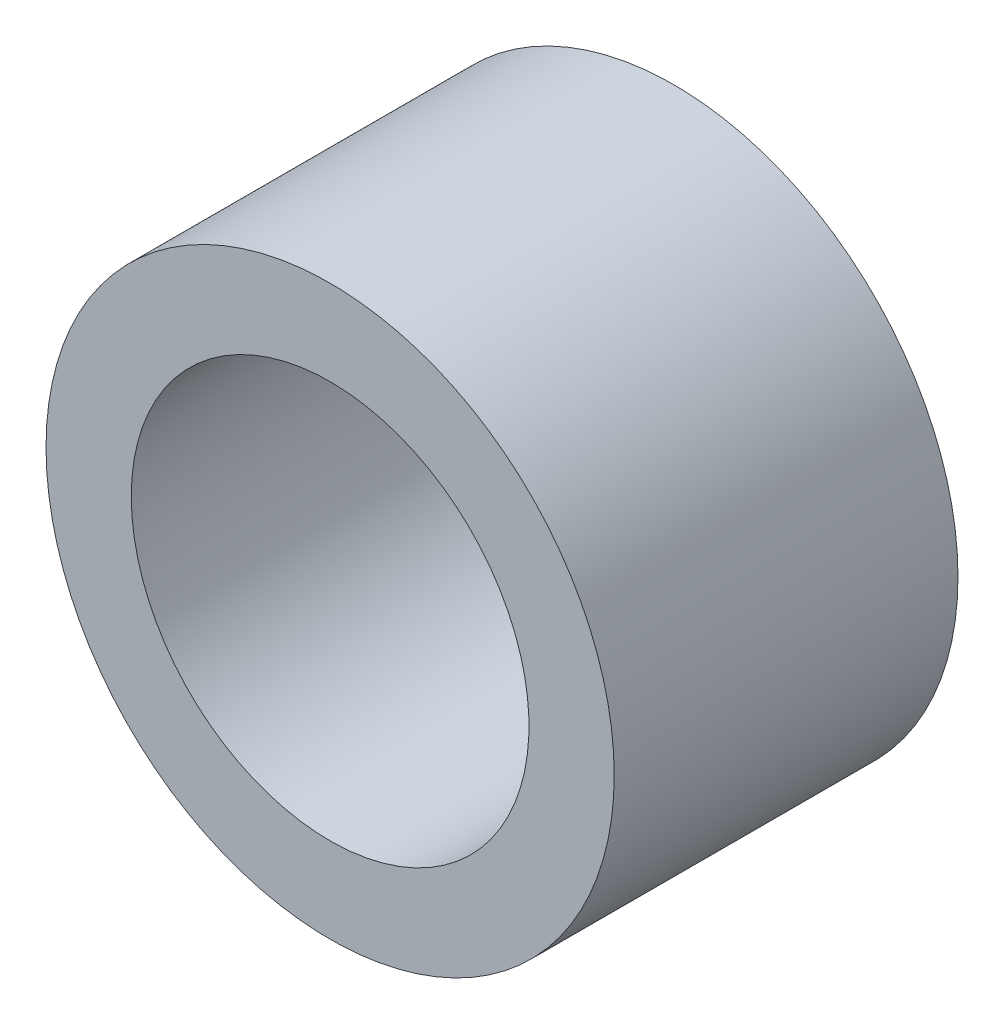
ISO-10303-21;
HEADER;
FILE_DESCRIPTION(('STEP AP214'),'2;1');
FILE_NAME('part.step','',(''),(''),'','','');
FILE_SCHEMA(('AUTOMOTIVE_DESIGN { 1 0 10303 214 1 1 1 1 }'));
ENDSEC;
DATA;
#1=APPLICATION_CONTEXT('core data for automotive mechanical design processes');
#2=APPLICATION_PROTOCOL_DEFINITION('international standard','automotive_design',2000,#1);
#3=PRODUCT_CONTEXT('',#1,'mechanical');
#4=PRODUCT('Part','Part','',(#3));
#5=PRODUCT_RELATED_PRODUCT_CATEGORY('part','',(#4));
#6=PRODUCT_DEFINITION_FORMATION('','',#4);
#7=PRODUCT_DEFINITION_CONTEXT('part definition',#1,'design');
#8=PRODUCT_DEFINITION('design','',#6,#7);
#9=PRODUCT_DEFINITION_SHAPE('','',#8);
#10=(LENGTH_UNIT() NAMED_UNIT(*) SI_UNIT(.MILLI.,.METRE.));
#11=(NAMED_UNIT(*) PLANE_ANGLE_UNIT() SI_UNIT($,.RADIAN.));
#12=(NAMED_UNIT(*) SI_UNIT($,.STERADIAN.) SOLID_ANGLE_UNIT());
#13=UNCERTAINTY_MEASURE_WITH_UNIT(LENGTH_MEASURE(1.E-05),#10,'distance_accuracy_value','');
#14=(GEOMETRIC_REPRESENTATION_CONTEXT(3) GLOBAL_UNCERTAINTY_ASSIGNED_CONTEXT((#13)) GLOBAL_UNIT_ASSIGNED_CONTEXT((#10,
#11,#12)) REPRESENTATION_CONTEXT('',''));
#15=CARTESIAN_POINT('',(0.,0.,0.));
#16=DIRECTION('',(0.,0.,1.));
#17=DIRECTION('',(1.,0.,0.));
#18=AXIS2_PLACEMENT_3D('',#15,#16,#17);
#19=CARTESIAN_POINT('',(0.,0.,121.));
#20=DIRECTION('',(0.,0.,1.));
#21=DIRECTION('',(1.,0.,0.));
#22=AXIS2_PLACEMENT_3D('',#19,#20,#21);
#23=PLANE('',#22);
#24=CARTESIAN_POINT('',(0.,0.,121.));
#25=DIRECTION('',(0.,0.,1.));
#26=DIRECTION('',(1.,0.,0.));
#27=AXIS2_PLACEMENT_3D('',#24,#25,#26);
#28=CIRCLE('',#27,100.);
#29=CARTESIAN_POINT('',(-100.,0.,121.));
#30=VERTEX_POINT('',#29);
#31=EDGE_CURVE('E10',#30,#30,#28,.T.);
#32=ORIENTED_EDGE('',*,*,#31,.T.);
#33=EDGE_LOOP('',(#32));
#34=FACE_BOUND('',#33,.T.);
#35=CARTESIAN_POINT('',(0.,0.,121.));
#36=DIRECTION('',(0.,0.,1.));
#37=DIRECTION('',(1.,0.,0.));
#38=AXIS2_PLACEMENT_3D('',#35,#36,#37);
#39=CIRCLE('',#38,70.);
#40=CARTESIAN_POINT('',(-70.,0.,121.));
#41=VERTEX_POINT('',#40);
#42=EDGE_CURVE('E44',#41,#41,#39,.T.);
#43=ORIENTED_EDGE('',*,*,#42,.F.);
#44=EDGE_LOOP('',(#43));
#45=FACE_BOUND('',#44,.T.);
#46=ADVANCED_FACE('F33',(#34,#45),#23,.T.);
#47=CARTESIAN_POINT('',(0.,0.,0.));
#48=DIRECTION('',(0.,0.,1.));
#49=DIRECTION('',(1.,0.,0.));
#50=AXIS2_PLACEMENT_3D('',#47,#48,#49);
#51=PLANE('',#50);
#52=CARTESIAN_POINT('',(0.,0.,0.));
#53=DIRECTION('',(0.,0.,1.));
#54=DIRECTION('',(1.,0.,0.));
#55=AXIS2_PLACEMENT_3D('',#52,#53,#54);
#56=CIRCLE('',#55,100.);
#57=CARTESIAN_POINT('',(-100.,0.,0.));
#58=VERTEX_POINT('',#57);
#59=EDGE_CURVE('E37',#58,#58,#56,.T.);
#60=ORIENTED_EDGE('',*,*,#59,.F.);
#61=EDGE_LOOP('',(#60));
#62=FACE_BOUND('',#61,.T.);
#63=CARTESIAN_POINT('',(0.,0.,0.));
#64=DIRECTION('',(0.,0.,1.));
#65=DIRECTION('',(1.,0.,0.));
#66=AXIS2_PLACEMENT_3D('',#63,#64,#65);
#67=CIRCLE('',#66,70.);
#68=CARTESIAN_POINT('',(-70.,0.,0.));
#69=VERTEX_POINT('',#68);
#70=EDGE_CURVE('E46',#69,#69,#67,.T.);
#71=ORIENTED_EDGE('',*,*,#70,.T.);
#72=EDGE_LOOP('',(#71));
#73=FACE_BOUND('',#72,.T.);
#74=ADVANCED_FACE('F56',(#62,#73),#51,.F.);
#75=CARTESIAN_POINT('',(0.,0.,121.));
#76=DIRECTION('',(0.,0.,-1.));
#77=DIRECTION('',(-1.,0.,0.));
#78=AXIS2_PLACEMENT_3D('',#75,#76,#77);
#79=CYLINDRICAL_SURFACE('',#78,100.);
#80=CARTESIAN_POINT('',(-100.,0.,121.));
#81=CARTESIAN_POINT('',(-100.,0.,119.739583333333));
#82=CARTESIAN_POINT('',(-100.,0.,118.479166666667));
#83=CARTESIAN_POINT('',(-100.,0.,115.958333333333));
#84=CARTESIAN_POINT('',(-100.,0.,114.697916666667));
#85=CARTESIAN_POINT('',(-100.,0.,112.177083333333));
#86=CARTESIAN_POINT('',(-100.,0.,110.916666666667));
#87=CARTESIAN_POINT('',(-100.,0.,108.395833333333));
#88=CARTESIAN_POINT('',(-100.,0.,107.135416666667));
#89=CARTESIAN_POINT('',(-100.,0.,104.614583333333));
#90=CARTESIAN_POINT('',(-100.,0.,103.354166666667));
#91=CARTESIAN_POINT('',(-100.,0.,100.833333333333));
#92=CARTESIAN_POINT('',(-100.,0.,99.5729166666667));
#93=CARTESIAN_POINT('',(-100.,0.,97.0520833333334));
#94=CARTESIAN_POINT('',(-100.,0.,95.7916666666667));
#95=CARTESIAN_POINT('',(-100.,0.,93.2708333333334));
#96=CARTESIAN_POINT('',(-100.,0.,92.0104166666667));
#97=CARTESIAN_POINT('',(-100.,0.,89.4895833333334));
#98=CARTESIAN_POINT('',(-100.,0.,88.2291666666667));
#99=CARTESIAN_POINT('',(-100.,0.,85.7083333333334));
#100=CARTESIAN_POINT('',(-100.,0.,84.4479166666667));
#101=CARTESIAN_POINT('',(-100.,0.,81.9270833333334));
#102=CARTESIAN_POINT('',(-100.,0.,80.6666666666667));
#103=CARTESIAN_POINT('',(-100.,0.,78.1458333333334));
#104=CARTESIAN_POINT('',(-100.,0.,76.8854166666667));
#105=CARTESIAN_POINT('',(-100.,0.,74.3645833333334));
#106=CARTESIAN_POINT('',(-100.,0.,73.1041666666667));
#107=CARTESIAN_POINT('',(-100.,0.,70.5833333333333));
#108=CARTESIAN_POINT('',(-100.,0.,69.3229166666667));
#109=CARTESIAN_POINT('',(-100.,0.,66.8020833333334));
#110=CARTESIAN_POINT('',(-100.,0.,65.5416666666667));
#111=CARTESIAN_POINT('',(-100.,0.,63.0208333333333));
#112=CARTESIAN_POINT('',(-100.,0.,61.7604166666667));
#113=CARTESIAN_POINT('',(-100.,0.,59.2395833333333));
#114=CARTESIAN_POINT('',(-100.,0.,57.9791666666667));
#115=CARTESIAN_POINT('',(-100.,0.,55.4583333333334));
#116=CARTESIAN_POINT('',(-100.,0.,54.1979166666667));
#117=CARTESIAN_POINT('',(-100.,0.,51.6770833333333));
#118=CARTESIAN_POINT('',(-100.,0.,50.4166666666667));
#119=CARTESIAN_POINT('',(-100.,0.,47.8958333333333));
#120=CARTESIAN_POINT('',(-100.,0.,46.6354166666667));
#121=CARTESIAN_POINT('',(-100.,0.,44.1145833333333));
#122=CARTESIAN_POINT('',(-100.,0.,42.8541666666667));
#123=CARTESIAN_POINT('',(-100.,0.,40.3333333333333));
#124=CARTESIAN_POINT('',(-100.,0.,39.0729166666667));
#125=CARTESIAN_POINT('',(-100.,0.,36.5520833333333));
#126=CARTESIAN_POINT('',(-100.,0.,35.2916666666667));
#127=CARTESIAN_POINT('',(-100.,0.,32.7708333333333));
#128=CARTESIAN_POINT('',(-100.,0.,31.5104166666667));
#129=CARTESIAN_POINT('',(-100.,0.,28.9895833333333));
#130=CARTESIAN_POINT('',(-100.,0.,27.7291666666667));
#131=CARTESIAN_POINT('',(-100.,0.,25.2083333333333));
#132=CARTESIAN_POINT('',(-100.,0.,23.9479166666667));
#133=CARTESIAN_POINT('',(-100.,0.,21.4270833333333));
#134=CARTESIAN_POINT('',(-100.,0.,20.1666666666667));
#135=CARTESIAN_POINT('',(-100.,0.,17.6458333333333));
#136=CARTESIAN_POINT('',(-100.,0.,16.3854166666667));
#137=CARTESIAN_POINT('',(-100.,0.,13.8645833333333));
#138=CARTESIAN_POINT('',(-100.,0.,12.6041666666667));
#139=CARTESIAN_POINT('',(-100.,0.,10.0833333333333));
#140=CARTESIAN_POINT('',(-100.,0.,8.82291666666666));
#141=CARTESIAN_POINT('',(-100.,0.,6.30208333333332));
#142=CARTESIAN_POINT('',(-100.,0.,5.04166666666665));
#143=CARTESIAN_POINT('',(-100.,0.,2.52083333333332));
#144=CARTESIAN_POINT('',(-100.,0.,1.26041666666665));
#145=CARTESIAN_POINT('',(-100.,0.,0.));
#146=B_SPLINE_CURVE_WITH_KNOTS('',3,(#80,#81,#82,#83,#84,#85,#86,#87,#88,#89,#90,#91,#92,#93,
#94,#95,#96,#97,#98,#99,#100,#101,#102,#103,#104,#105,#106,#107,#108,#109,#110,#111,#112,#113,
#114,#115,#116,#117,#118,#119,#120,#121,#122,#123,#124,#125,#126,#127,#128,#129,#130,#131,#132,
#133,#134,#135,#136,#137,#138,#139,#140,#141,#142,#143,#144,#145),.UNSPECIFIED.,.F.,.F.,(4,2,2,
2,2,2,2,2,2,2,2,2,2,2,2,2,2,2,2,2,2,2,2,2,2,2,2,2,2,2,2,2,4),(0.,3.78125000000001,
7.56250000000001,11.34375,15.125,18.90625,22.6875,26.46875,30.25,34.03125,37.8125,41.59375,
45.375,49.15625,52.9375,56.71875,60.5,64.28125,68.0625,71.84375,75.625,79.40625,83.1875,
86.96875,90.75,94.5312500000001,98.3125000000001,102.09375,105.875,109.65625,113.4375,117.21875,
121.),.UNSPECIFIED.);
#147=EDGE_CURVE('BSEAM35',#30,#58,#146,.T.);
#148=ORIENTED_EDGE('',*,*,#31,.F.);
#149=ORIENTED_EDGE('',*,*,#59,.T.);
#150=ORIENTED_EDGE('',*,*,#147,.T.);
#151=ORIENTED_EDGE('',*,*,#147,.F.);
#152=EDGE_LOOP('',(#148,#150,#149,#151));
#153=FACE_BOUND('',#152,.T.);
#154=ADVANCED_FACE('F35',(#153),#79,.T.);
#155=CARTESIAN_POINT('',(0.,0.,121.));
#156=DIRECTION('',(0.,0.,-1.));
#157=DIRECTION('',(-1.,0.,0.));
#158=AXIS2_PLACEMENT_3D('',#155,#156,#157);
#159=CYLINDRICAL_SURFACE('',#158,70.);
#160=CARTESIAN_POINT('',(-70.,0.,121.));
#161=CARTESIAN_POINT('',(-70.,0.,119.739583333333));
#162=CARTESIAN_POINT('',(-70.,0.,118.479166666667));
#163=CARTESIAN_POINT('',(-70.,0.,115.958333333333));
#164=CARTESIAN_POINT('',(-70.,0.,114.697916666667));
#165=CARTESIAN_POINT('',(-70.,0.,112.177083333333));
#166=CARTESIAN_POINT('',(-70.,0.,110.916666666667));
#167=CARTESIAN_POINT('',(-70.,0.,108.395833333333));
#168=CARTESIAN_POINT('',(-70.,0.,107.135416666667));
#169=CARTESIAN_POINT('',(-70.,0.,104.614583333333));
#170=CARTESIAN_POINT('',(-70.,0.,103.354166666667));
#171=CARTESIAN_POINT('',(-70.,0.,100.833333333333));
#172=CARTESIAN_POINT('',(-70.,0.,99.5729166666667));
#173=CARTESIAN_POINT('',(-70.,0.,97.0520833333334));
#174=CARTESIAN_POINT('',(-70.,0.,95.7916666666667));
#175=CARTESIAN_POINT('',(-70.,0.,93.2708333333334));
#176=CARTESIAN_POINT('',(-70.,0.,92.0104166666667));
#177=CARTESIAN_POINT('',(-70.,0.,89.4895833333334));
#178=CARTESIAN_POINT('',(-70.,0.,88.2291666666667));
#179=CARTESIAN_POINT('',(-70.,0.,85.7083333333334));
#180=CARTESIAN_POINT('',(-70.,0.,84.4479166666667));
#181=CARTESIAN_POINT('',(-70.,0.,81.9270833333334));
#182=CARTESIAN_POINT('',(-70.,0.,80.6666666666667));
#183=CARTESIAN_POINT('',(-70.,0.,78.1458333333334));
#184=CARTESIAN_POINT('',(-70.,0.,76.8854166666667));
#185=CARTESIAN_POINT('',(-70.,0.,74.3645833333334));
#186=CARTESIAN_POINT('',(-70.,0.,73.1041666666667));
#187=CARTESIAN_POINT('',(-70.,0.,70.5833333333333));
#188=CARTESIAN_POINT('',(-70.,0.,69.3229166666667));
#189=CARTESIAN_POINT('',(-70.,0.,66.8020833333334));
#190=CARTESIAN_POINT('',(-70.,0.,65.5416666666667));
#191=CARTESIAN_POINT('',(-70.,0.,63.0208333333333));
#192=CARTESIAN_POINT('',(-70.,0.,61.7604166666667));
#193=CARTESIAN_POINT('',(-70.,0.,59.2395833333333));
#194=CARTESIAN_POINT('',(-70.,0.,57.9791666666667));
#195=CARTESIAN_POINT('',(-70.,0.,55.4583333333334));
#196=CARTESIAN_POINT('',(-70.,0.,54.1979166666667));
#197=CARTESIAN_POINT('',(-70.,0.,51.6770833333333));
#198=CARTESIAN_POINT('',(-70.,0.,50.4166666666667));
#199=CARTESIAN_POINT('',(-70.,0.,47.8958333333333));
#200=CARTESIAN_POINT('',(-70.,0.,46.6354166666667));
#201=CARTESIAN_POINT('',(-70.,0.,44.1145833333333));
#202=CARTESIAN_POINT('',(-70.,0.,42.8541666666667));
#203=CARTESIAN_POINT('',(-70.,0.,40.3333333333333));
#204=CARTESIAN_POINT('',(-70.,0.,39.0729166666667));
#205=CARTESIAN_POINT('',(-70.,0.,36.5520833333333));
#206=CARTESIAN_POINT('',(-70.,0.,35.2916666666667));
#207=CARTESIAN_POINT('',(-70.,0.,32.7708333333333));
#208=CARTESIAN_POINT('',(-70.,0.,31.5104166666667));
#209=CARTESIAN_POINT('',(-70.,0.,28.9895833333333));
#210=CARTESIAN_POINT('',(-70.,0.,27.7291666666667));
#211=CARTESIAN_POINT('',(-70.,0.,25.2083333333333));
#212=CARTESIAN_POINT('',(-70.,0.,23.9479166666667));
#213=CARTESIAN_POINT('',(-70.,0.,21.4270833333333));
#214=CARTESIAN_POINT('',(-70.,0.,20.1666666666667));
#215=CARTESIAN_POINT('',(-70.,0.,17.6458333333333));
#216=CARTESIAN_POINT('',(-70.,0.,16.3854166666667));
#217=CARTESIAN_POINT('',(-70.,0.,13.8645833333333));
#218=CARTESIAN_POINT('',(-70.,0.,12.6041666666667));
#219=CARTESIAN_POINT('',(-70.,0.,10.0833333333333));
#220=CARTESIAN_POINT('',(-70.,0.,8.82291666666666));
#221=CARTESIAN_POINT('',(-70.,0.,6.30208333333332));
#222=CARTESIAN_POINT('',(-70.,0.,5.04166666666665));
#223=CARTESIAN_POINT('',(-70.,0.,2.52083333333332));
#224=CARTESIAN_POINT('',(-70.,0.,1.26041666666665));
#225=CARTESIAN_POINT('',(-70.,0.,0.));
#226=B_SPLINE_CURVE_WITH_KNOTS('',3,(#160,#161,#162,#163,#164,#165,#166,#167,#168,#169,#170,
#171,#172,#173,#174,#175,#176,#177,#178,#179,#180,#181,#182,#183,#184,#185,#186,#187,#188,#189,
#190,#191,#192,#193,#194,#195,#196,#197,#198,#199,#200,#201,#202,#203,#204,#205,#206,#207,#208,
#209,#210,#211,#212,#213,#214,#215,#216,#217,#218,#219,#220,#221,#222,#223,#224,#225),
.UNSPECIFIED.,.F.,.F.,(4,2,2,2,2,2,2,2,2,2,2,2,2,2,2,2,2,2,2,2,2,2,2,2,2,2,2,2,2,2,2,2,4),(0.,
3.78125000000001,7.56250000000001,11.34375,15.125,18.90625,22.6875,26.46875,30.25,34.03125,
37.8125,41.59375,45.375,49.15625,52.9375,56.71875,60.5,64.28125,68.0625,71.84375,75.625,
79.40625,83.1875,86.96875,90.75,94.5312500000001,98.3125000000001,102.09375,105.875,109.65625,
113.4375,117.21875,121.),.UNSPECIFIED.);
#227=EDGE_CURVE('BSEAM52',#41,#69,#226,.T.);
#228=ORIENTED_EDGE('',*,*,#42,.T.);
#229=ORIENTED_EDGE('',*,*,#70,.F.);
#230=ORIENTED_EDGE('',*,*,#227,.T.);
#231=ORIENTED_EDGE('',*,*,#227,.F.);
#232=EDGE_LOOP('',(#228,#230,#229,#231));
#233=FACE_BOUND('',#232,.T.);
#234=ADVANCED_FACE('F52',(#233),#159,.F.);
#235=CLOSED_SHELL('',(#46,#74,#154,#234));
#236=MANIFOLD_SOLID_BREP('B2',#235);
#237=ADVANCED_BREP_SHAPE_REPRESENTATION('',(#18,#236),#14);
#238=SHAPE_DEFINITION_REPRESENTATION(#9,#237);
ENDSEC;
END-ISO-10303-21;
